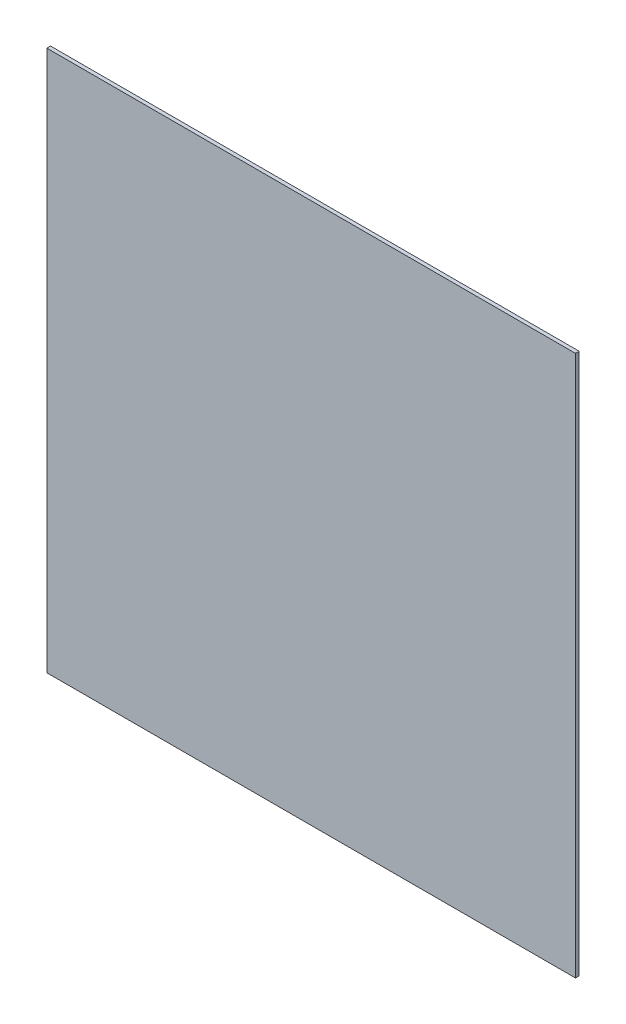
ISO-10303-21;
HEADER;
FILE_DESCRIPTION(('STEP AP214'),'2;1');
FILE_NAME('part.step','',(''),(''),'','','');
FILE_SCHEMA(('AUTOMOTIVE_DESIGN { 1 0 10303 214 1 1 1 1 }'));
ENDSEC;
DATA;
#1=APPLICATION_CONTEXT('core data for automotive mechanical design processes');
#2=APPLICATION_PROTOCOL_DEFINITION('international standard','automotive_design',2000,#1);
#3=PRODUCT_CONTEXT('',#1,'mechanical');
#4=PRODUCT('Part','Part','',(#3));
#5=PRODUCT_RELATED_PRODUCT_CATEGORY('part','',(#4));
#6=PRODUCT_DEFINITION_FORMATION('','',#4);
#7=PRODUCT_DEFINITION_CONTEXT('part definition',#1,'design');
#8=PRODUCT_DEFINITION('design','',#6,#7);
#9=PRODUCT_DEFINITION_SHAPE('','',#8);
#10=(LENGTH_UNIT() NAMED_UNIT(*) SI_UNIT(.MILLI.,.METRE.));
#11=(NAMED_UNIT(*) PLANE_ANGLE_UNIT() SI_UNIT($,.RADIAN.));
#12=(NAMED_UNIT(*) SI_UNIT($,.STERADIAN.) SOLID_ANGLE_UNIT());
#13=UNCERTAINTY_MEASURE_WITH_UNIT(LENGTH_MEASURE(1.E-05),#10,'distance_accuracy_value','');
#14=(GEOMETRIC_REPRESENTATION_CONTEXT(3) GLOBAL_UNCERTAINTY_ASSIGNED_CONTEXT((#13)) GLOBAL_UNIT_ASSIGNED_CONTEXT((#10,
#11,#12)) REPRESENTATION_CONTEXT('',''));
#15=CARTESIAN_POINT('',(0.,0.,0.));
#16=DIRECTION('',(0.,0.,1.));
#17=DIRECTION('',(1.,0.,0.));
#18=AXIS2_PLACEMENT_3D('',#15,#16,#17);
#19=CARTESIAN_POINT('',(-215.,220.,3.));
#20=DIRECTION('',(1.,0.,0.));
#21=DIRECTION('',(0.,1.,0.));
#22=AXIS2_PLACEMENT_3D('',#19,#20,#21);
#23=PLANE('',#22);
#24=DIRECTION('',(0.,-1.,0.));
#25=VECTOR('',#24,1.);
#26=CARTESIAN_POINT('',(-215.,220.,0.));
#27=LINE('',#26,#25);
#28=CARTESIAN_POINT('',(-215.,220.,0.));
#29=VERTEX_POINT('',#28);
#30=CARTESIAN_POINT('',(-215.,-220.,0.));
#31=VERTEX_POINT('',#30);
#32=EDGE_CURVE('E99',#29,#31,#27,.T.);
#33=ORIENTED_EDGE('',*,*,#32,.T.);
#34=DIRECTION('',(0.,0.,-1.));
#35=VECTOR('',#34,1.);
#36=CARTESIAN_POINT('',(-215.,-220.,3.));
#37=LINE('',#36,#35);
#38=CARTESIAN_POINT('',(-215.,-220.,3.));
#39=VERTEX_POINT('',#38);
#40=EDGE_CURVE('E11',#39,#31,#37,.T.);
#41=ORIENTED_EDGE('',*,*,#40,.F.);
#42=DIRECTION('',(0.,-1.,0.));
#43=VECTOR('',#42,1.);
#44=CARTESIAN_POINT('',(-215.,220.,3.));
#45=LINE('',#44,#43);
#46=CARTESIAN_POINT('',(-215.,220.,3.));
#47=VERTEX_POINT('',#46);
#48=EDGE_CURVE('E87',#47,#39,#45,.T.);
#49=ORIENTED_EDGE('',*,*,#48,.F.);
#50=DIRECTION('',(0.,0.,-1.));
#51=VECTOR('',#50,1.);
#52=CARTESIAN_POINT('',(-215.,220.,3.));
#53=LINE('',#52,#51);
#54=EDGE_CURVE('E95',#47,#29,#53,.T.);
#55=ORIENTED_EDGE('',*,*,#54,.T.);
#56=EDGE_LOOP('',(#33,#41,#49,#55));
#57=FACE_BOUND('',#56,.T.);
#58=ADVANCED_FACE('F36',(#57),#23,.F.);
#59=CARTESIAN_POINT('',(-215.,-220.,3.));
#60=DIRECTION('',(0.,1.,0.));
#61=DIRECTION('',(-1.,0.,0.));
#62=AXIS2_PLACEMENT_3D('',#59,#60,#61);
#63=PLANE('',#62);
#64=DIRECTION('',(1.,0.,0.));
#65=VECTOR('',#64,1.);
#66=CARTESIAN_POINT('',(-215.,-220.,0.));
#67=LINE('',#66,#65);
#68=CARTESIAN_POINT('',(215.,-220.,0.));
#69=VERTEX_POINT('',#68);
#70=EDGE_CURVE('E91',#31,#69,#67,.T.);
#71=ORIENTED_EDGE('',*,*,#70,.T.);
#72=DIRECTION('',(0.,0.,-1.));
#73=VECTOR('',#72,1.);
#74=CARTESIAN_POINT('',(215.,-220.,3.));
#75=LINE('',#74,#73);
#76=CARTESIAN_POINT('',(215.,-220.,3.));
#77=VERTEX_POINT('',#76);
#78=EDGE_CURVE('E44',#77,#69,#75,.T.);
#79=ORIENTED_EDGE('',*,*,#78,.F.);
#80=DIRECTION('',(1.,0.,0.));
#81=VECTOR('',#80,1.);
#82=CARTESIAN_POINT('',(-215.,-220.,3.));
#83=LINE('',#82,#81);
#84=EDGE_CURVE('E82',#39,#77,#83,.T.);
#85=ORIENTED_EDGE('',*,*,#84,.F.);
#86=ORIENTED_EDGE('',*,*,#40,.T.);
#87=EDGE_LOOP('',(#71,#79,#85,#86));
#88=FACE_BOUND('',#87,.T.);
#89=ADVANCED_FACE('F90',(#88),#63,.F.);
#90=CARTESIAN_POINT('',(215.,220.,3.));
#91=DIRECTION('',(-1.,0.,0.));
#92=DIRECTION('',(0.,-1.,0.));
#93=AXIS2_PLACEMENT_3D('',#90,#91,#92);
#94=PLANE('',#93);
#95=DIRECTION('',(0.,1.,0.));
#96=VECTOR('',#95,1.);
#97=CARTESIAN_POINT('',(215.,220.,0.));
#98=LINE('',#97,#96);
#99=CARTESIAN_POINT('',(215.,220.,0.));
#100=VERTEX_POINT('',#99);
#101=EDGE_CURVE('E69',#69,#100,#98,.T.);
#102=ORIENTED_EDGE('',*,*,#101,.T.);
#103=DIRECTION('',(0.,0.,-1.));
#104=VECTOR('',#103,1.);
#105=CARTESIAN_POINT('',(215.,220.,3.));
#106=LINE('',#105,#104);
#107=CARTESIAN_POINT('',(215.,220.,3.));
#108=VERTEX_POINT('',#107);
#109=EDGE_CURVE('E92',#108,#100,#106,.T.);
#110=ORIENTED_EDGE('',*,*,#109,.F.);
#111=DIRECTION('',(0.,1.,0.));
#112=VECTOR('',#111,1.);
#113=CARTESIAN_POINT('',(215.,220.,3.));
#114=LINE('',#113,#112);
#115=EDGE_CURVE('E85',#77,#108,#114,.T.);
#116=ORIENTED_EDGE('',*,*,#115,.F.);
#117=ORIENTED_EDGE('',*,*,#78,.T.);
#118=EDGE_LOOP('',(#102,#110,#116,#117));
#119=FACE_BOUND('',#118,.T.);
#120=ADVANCED_FACE('F93',(#119),#94,.F.);
#121=CARTESIAN_POINT('',(-215.,220.,3.));
#122=DIRECTION('',(0.,-1.,0.));
#123=DIRECTION('',(1.,0.,0.));
#124=AXIS2_PLACEMENT_3D('',#121,#122,#123);
#125=PLANE('',#124);
#126=DIRECTION('',(-1.,0.,0.));
#127=VECTOR('',#126,1.);
#128=CARTESIAN_POINT('',(-215.,220.,0.));
#129=LINE('',#128,#127);
#130=EDGE_CURVE('E75',#100,#29,#129,.T.);
#131=ORIENTED_EDGE('',*,*,#130,.T.);
#132=ORIENTED_EDGE('',*,*,#54,.F.);
#133=DIRECTION('',(-1.,0.,0.));
#134=VECTOR('',#133,1.);
#135=CARTESIAN_POINT('',(-215.,220.,3.));
#136=LINE('',#135,#134);
#137=EDGE_CURVE('E52',#108,#47,#136,.T.);
#138=ORIENTED_EDGE('',*,*,#137,.F.);
#139=ORIENTED_EDGE('',*,*,#109,.T.);
#140=EDGE_LOOP('',(#131,#132,#138,#139));
#141=FACE_BOUND('',#140,.T.);
#142=ADVANCED_FACE('F106',(#141),#125,.F.);
#143=CARTESIAN_POINT('',(0.,0.,3.));
#144=DIRECTION('',(0.,0.,1.));
#145=DIRECTION('',(1.,0.,0.));
#146=AXIS2_PLACEMENT_3D('',#143,#144,#145);
#147=PLANE('',#146);
#148=ORIENTED_EDGE('',*,*,#48,.T.);
#149=ORIENTED_EDGE('',*,*,#84,.T.);
#150=ORIENTED_EDGE('',*,*,#115,.T.);
#151=ORIENTED_EDGE('',*,*,#137,.T.);
#152=EDGE_LOOP('',(#148,#149,#150,#151));
#153=FACE_BOUND('',#152,.T.);
#154=ADVANCED_FACE('F83',(#153),#147,.T.);
#155=CARTESIAN_POINT('',(0.,0.,0.));
#156=DIRECTION('',(0.,0.,1.));
#157=DIRECTION('',(1.,0.,0.));
#158=AXIS2_PLACEMENT_3D('',#155,#156,#157);
#159=PLANE('',#158);
#160=ORIENTED_EDGE('',*,*,#32,.F.);
#161=ORIENTED_EDGE('',*,*,#130,.F.);
#162=ORIENTED_EDGE('',*,*,#101,.F.);
#163=ORIENTED_EDGE('',*,*,#70,.F.);
#164=EDGE_LOOP('',(#160,#161,#162,#163));
#165=FACE_BOUND('',#164,.T.);
#166=ADVANCED_FACE('F109',(#165),#159,.F.);
#167=CLOSED_SHELL('',(#58,#89,#120,#142,#154,#166));
#168=MANIFOLD_SOLID_BREP('B2',#167);
#169=ADVANCED_BREP_SHAPE_REPRESENTATION('',(#18,#168),#14);
#170=SHAPE_DEFINITION_REPRESENTATION(#9,#169);
ENDSEC;
END-ISO-10303-21;
